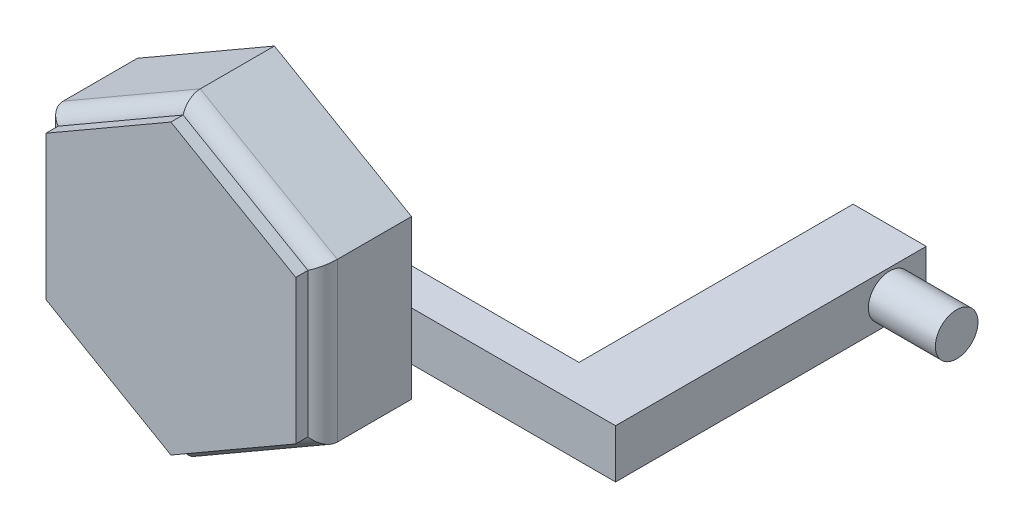
ISO-10303-21;
HEADER;
FILE_DESCRIPTION(('STEP AP214'),'2;1');
FILE_NAME('part.step','',(''),(''),'','','');
FILE_SCHEMA(('AUTOMOTIVE_DESIGN { 1 0 10303 214 1 1 1 1 }'));
ENDSEC;
DATA;
#1=APPLICATION_CONTEXT('core data for automotive mechanical design processes');
#2=APPLICATION_PROTOCOL_DEFINITION('international standard','automotive_design',2000,#1);
#3=PRODUCT_CONTEXT('',#1,'mechanical');
#4=PRODUCT('Part','Part','',(#3));
#5=PRODUCT_RELATED_PRODUCT_CATEGORY('part','',(#4));
#6=PRODUCT_DEFINITION_FORMATION('','',#4);
#7=PRODUCT_DEFINITION_CONTEXT('part definition',#1,'design');
#8=PRODUCT_DEFINITION('design','',#6,#7);
#9=PRODUCT_DEFINITION_SHAPE('','',#8);
#10=(LENGTH_UNIT() NAMED_UNIT(*) SI_UNIT(.MILLI.,.METRE.));
#11=(NAMED_UNIT(*) PLANE_ANGLE_UNIT() SI_UNIT($,.RADIAN.));
#12=(NAMED_UNIT(*) SI_UNIT($,.STERADIAN.) SOLID_ANGLE_UNIT());
#13=UNCERTAINTY_MEASURE_WITH_UNIT(LENGTH_MEASURE(1.E-05),#10,'distance_accuracy_value','');
#14=(GEOMETRIC_REPRESENTATION_CONTEXT(3) GLOBAL_UNCERTAINTY_ASSIGNED_CONTEXT((#13)) GLOBAL_UNIT_ASSIGNED_CONTEXT((#10,
#11,#12)) REPRESENTATION_CONTEXT('',''));
#15=CARTESIAN_POINT('',(0.,0.,0.));
#16=DIRECTION('',(0.,0.,1.));
#17=DIRECTION('',(1.,0.,0.));
#18=AXIS2_PLACEMENT_3D('',#15,#16,#17);
#19=CARTESIAN_POINT('',(0.,0.,-6.));
#20=DIRECTION('',(0.,0.,1.));
#21=DIRECTION('',(1.,0.,0.));
#22=AXIS2_PLACEMENT_3D('',#19,#20,#21);
#23=PLANE('',#22);
#24=DIRECTION('',(-1.,0.,0.));
#25=VECTOR('',#24,1.);
#26=CARTESIAN_POINT('',(0.,-8.,-6.));
#27=LINE('',#26,#25);
#28=CARTESIAN_POINT('',(44.,-8.00000000000001,-6.));
#29=VERTEX_POINT('',#28);
#30=CARTESIAN_POINT('',(4.,-8.,-6.));
#31=VERTEX_POINT('',#30);
#32=EDGE_CURVE('E205',#29,#31,#27,.T.);
#33=ORIENTED_EDGE('',*,*,#32,.T.);
#34=DIRECTION('',(0.,1.,0.));
#35=VECTOR('',#34,1.);
#36=CARTESIAN_POINT('',(4.,0.,-6.));
#37=LINE('',#36,#35);
#38=CARTESIAN_POINT('',(4.,0.,-6.));
#39=VERTEX_POINT('',#38);
#40=EDGE_CURVE('E334',#31,#39,#37,.T.);
#41=ORIENTED_EDGE('',*,*,#40,.T.);
#42=DIRECTION('',(1.,0.,0.));
#43=VECTOR('',#42,1.);
#44=CARTESIAN_POINT('',(0.,0.,-6.));
#45=LINE('',#44,#43);
#46=CARTESIAN_POINT('',(44.,0.,-6.));
#47=VERTEX_POINT('',#46);
#48=EDGE_CURVE('E203',#39,#47,#45,.T.);
#49=ORIENTED_EDGE('',*,*,#48,.T.);
#50=DIRECTION('',(0.,1.,0.));
#51=VECTOR('',#50,1.);
#52=CARTESIAN_POINT('',(44.,0.,-6.));
#53=LINE('',#52,#51);
#54=EDGE_CURVE('E191',#29,#47,#53,.T.);
#55=ORIENTED_EDGE('',*,*,#54,.F.);
#56=EDGE_LOOP('',(#33,#41,#49,#55));
#57=FACE_BOUND('',#56,.T.);
#58=ADVANCED_FACE('F36',(#57),#23,.F.);
#59=CARTESIAN_POINT('',(0.,0.,0.));
#60=DIRECTION('',(0.,0.,1.));
#61=DIRECTION('',(1.,0.,0.));
#62=AXIS2_PLACEMENT_3D('',#59,#60,#61);
#63=PLANE('',#62);
#64=DIRECTION('',(-1.,0.,0.));
#65=VECTOR('',#64,1.);
#66=CARTESIAN_POINT('',(0.,-8.,0.));
#67=LINE('',#66,#65);
#68=CARTESIAN_POINT('',(22.5,-8.,0.));
#69=VERTEX_POINT('',#68);
#70=CARTESIAN_POINT('',(0.,-8.,0.));
#71=VERTEX_POINT('',#70);
#72=EDGE_CURVE('E217',#69,#71,#67,.T.);
#73=ORIENTED_EDGE('',*,*,#72,.F.);
#74=DIRECTION('',(0.,1.,0.));
#75=VECTOR('',#74,1.);
#76=CARTESIAN_POINT('',(22.5,-12.9903810567666,0.));
#77=LINE('',#76,#75);
#78=CARTESIAN_POINT('',(22.5,-12.9903810567666,0.));
#79=VERTEX_POINT('',#78);
#80=EDGE_CURVE('E287',#79,#69,#77,.T.);
#81=ORIENTED_EDGE('',*,*,#80,.F.);
#82=DIRECTION('',(0.866025403784438,0.5,0.));
#83=VECTOR('',#82,1.);
#84=CARTESIAN_POINT('',(0.,-25.9807621135332,0.));
#85=LINE('',#84,#83);
#86=CARTESIAN_POINT('',(0.,-25.9807621135332,0.));
#87=VERTEX_POINT('',#86);
#88=EDGE_CURVE('E283',#87,#79,#85,.T.);
#89=ORIENTED_EDGE('',*,*,#88,.F.);
#90=DIRECTION('',(0.866025403784439,-0.5,0.));
#91=VECTOR('',#90,1.);
#92=CARTESIAN_POINT('',(-22.5,-12.9903810567666,0.));
#93=LINE('',#92,#91);
#94=CARTESIAN_POINT('',(-22.5,-12.9903810567666,0.));
#95=VERTEX_POINT('',#94);
#96=EDGE_CURVE('E280',#95,#87,#93,.T.);
#97=ORIENTED_EDGE('',*,*,#96,.F.);
#98=DIRECTION('',(0.,-1.,0.));
#99=VECTOR('',#98,1.);
#100=CARTESIAN_POINT('',(-22.5,12.9903810567666,0.));
#101=LINE('',#100,#99);
#102=CARTESIAN_POINT('',(-22.5,12.9903810567666,0.));
#103=VERTEX_POINT('',#102);
#104=EDGE_CURVE('E277',#103,#95,#101,.T.);
#105=ORIENTED_EDGE('',*,*,#104,.F.);
#106=DIRECTION('',(-0.866025403784438,-0.5,0.));
#107=VECTOR('',#106,1.);
#108=CARTESIAN_POINT('',(0.,25.9807621135332,0.));
#109=LINE('',#108,#107);
#110=CARTESIAN_POINT('',(0.,25.9807621135332,0.));
#111=VERTEX_POINT('',#110);
#112=EDGE_CURVE('E274',#111,#103,#109,.T.);
#113=ORIENTED_EDGE('',*,*,#112,.F.);
#114=DIRECTION('',(-0.866025403784439,0.5,0.));
#115=VECTOR('',#114,1.);
#116=CARTESIAN_POINT('',(22.5,12.9903810567666,0.));
#117=LINE('',#116,#115);
#118=CARTESIAN_POINT('',(22.5,12.9903810567666,0.));
#119=VERTEX_POINT('',#118);
#120=EDGE_CURVE('E271',#119,#111,#117,.T.);
#121=ORIENTED_EDGE('',*,*,#120,.F.);
#122=CARTESIAN_POINT('',(22.5,0.,0.));
#123=VERTEX_POINT('',#122);
#124=EDGE_CURVE('E286',#123,#119,#77,.T.);
#125=ORIENTED_EDGE('',*,*,#124,.F.);
#126=DIRECTION('',(1.,0.,0.));
#127=VECTOR('',#126,1.);
#128=CARTESIAN_POINT('',(0.,0.,0.));
#129=LINE('',#128,#127);
#130=CARTESIAN_POINT('',(0.,0.,0.));
#131=VERTEX_POINT('',#130);
#132=EDGE_CURVE('E210',#131,#123,#129,.T.);
#133=ORIENTED_EDGE('',*,*,#132,.F.);
#134=DIRECTION('',(0.,1.,0.));
#135=VECTOR('',#134,1.);
#136=CARTESIAN_POINT('',(0.,0.,0.));
#137=LINE('',#136,#135);
#138=EDGE_CURVE('E194',#71,#131,#137,.T.);
#139=ORIENTED_EDGE('',*,*,#138,.F.);
#140=EDGE_LOOP('',(#73,#81,#89,#97,#105,#113,#121,#125,#133,#139));
#141=FACE_BOUND('',#140,.T.);
#142=ADVANCED_FACE('F349',(#141),#63,.F.);
#143=CARTESIAN_POINT('',(22.5,12.9903810567666,15.));
#144=DIRECTION('',(-0.5,-0.866025403784439,0.));
#145=DIRECTION('',(0.866025403784439,-0.5,0.));
#146=AXIS2_PLACEMENT_3D('',#143,#144,#145);
#147=PLANE('',#146);
#148=DIRECTION('',(0.,0.,-1.));
#149=VECTOR('',#148,1.);
#150=CARTESIAN_POINT('',(0.,25.9807621135332,15.));
#151=LINE('',#150,#149);
#152=CARTESIAN_POINT('',(0.,25.9807621135332,12.1715728752538));
#153=VERTEX_POINT('',#152);
#154=EDGE_CURVE('E302',#153,#111,#151,.T.);
#155=ORIENTED_EDGE('',*,*,#154,.F.);
#156=DIRECTION('',(0.866025403784439,-0.5,0.));
#157=VECTOR('',#156,1.);
#158=CARTESIAN_POINT('',(22.5,12.9903810567666,12.1715728752538));
#159=LINE('',#158,#157);
#160=CARTESIAN_POINT('',(22.5,12.9903810567666,12.1715728752538));
#161=VERTEX_POINT('',#160);
#162=EDGE_CURVE('E315',#153,#161,#159,.T.);
#163=ORIENTED_EDGE('',*,*,#162,.T.);
#164=DIRECTION('',(0.,0.,-1.));
#165=VECTOR('',#164,1.);
#166=CARTESIAN_POINT('',(22.5,12.9903810567666,15.));
#167=LINE('',#166,#165);
#168=EDGE_CURVE('E290',#161,#119,#167,.T.);
#169=ORIENTED_EDGE('',*,*,#168,.T.);
#170=ORIENTED_EDGE('',*,*,#120,.T.);
#171=EDGE_LOOP('',(#155,#163,#169,#170));
#172=FACE_BOUND('',#171,.T.);
#173=ADVANCED_FACE('F389',(#172),#147,.F.);
#174=CARTESIAN_POINT('',(0.,25.9807621135332,15.));
#175=DIRECTION('',(0.5,-0.866025403784438,0.));
#176=DIRECTION('',(0.866025403784438,0.5,0.));
#177=AXIS2_PLACEMENT_3D('',#174,#175,#176);
#178=PLANE('',#177);
#179=DIRECTION('',(0.,0.,-1.));
#180=VECTOR('',#179,1.);
#181=CARTESIAN_POINT('',(-22.5,12.9903810567666,15.));
#182=LINE('',#181,#180);
#183=CARTESIAN_POINT('',(-22.5,12.9903810567666,12.1715728752538));
#184=VERTEX_POINT('',#183);
#185=EDGE_CURVE('E300',#184,#103,#182,.T.);
#186=ORIENTED_EDGE('',*,*,#185,.F.);
#187=DIRECTION('',(0.866025403784438,0.5,0.));
#188=VECTOR('',#187,1.);
#189=CARTESIAN_POINT('',(0.,25.9807621135332,12.1715728752538));
#190=LINE('',#189,#188);
#191=EDGE_CURVE('E304',#184,#153,#190,.T.);
#192=ORIENTED_EDGE('',*,*,#191,.T.);
#193=ORIENTED_EDGE('',*,*,#154,.T.);
#194=ORIENTED_EDGE('',*,*,#112,.T.);
#195=EDGE_LOOP('',(#186,#192,#193,#194));
#196=FACE_BOUND('',#195,.T.);
#197=ADVANCED_FACE('F490',(#196),#178,.F.);
#198=CARTESIAN_POINT('',(-22.5,12.9903810567666,15.));
#199=DIRECTION('',(1.,0.,0.));
#200=DIRECTION('',(0.,1.,0.));
#201=AXIS2_PLACEMENT_3D('',#198,#199,#200);
#202=PLANE('',#201);
#203=DIRECTION('',(0.,0.,-1.));
#204=VECTOR('',#203,1.);
#205=CARTESIAN_POINT('',(-22.5,-12.9903810567666,15.));
#206=LINE('',#205,#204);
#207=CARTESIAN_POINT('',(-22.5,-12.9903810567666,12.1715728752538));
#208=VERTEX_POINT('',#207);
#209=EDGE_CURVE('E298',#208,#95,#206,.T.);
#210=ORIENTED_EDGE('',*,*,#209,.F.);
#211=DIRECTION('',(0.,1.,0.));
#212=VECTOR('',#211,1.);
#213=CARTESIAN_POINT('',(-22.5,12.9903810567666,12.1715728752538));
#214=LINE('',#213,#212);
#215=EDGE_CURVE('E307',#208,#184,#214,.T.);
#216=ORIENTED_EDGE('',*,*,#215,.T.);
#217=ORIENTED_EDGE('',*,*,#185,.T.);
#218=ORIENTED_EDGE('',*,*,#104,.T.);
#219=EDGE_LOOP('',(#210,#216,#217,#218));
#220=FACE_BOUND('',#219,.T.);
#221=ADVANCED_FACE('F446',(#220),#202,.F.);
#222=CARTESIAN_POINT('',(-22.5,-12.9903810567666,15.));
#223=DIRECTION('',(0.5,0.866025403784439,0.));
#224=DIRECTION('',(-0.866025403784439,0.5,0.));
#225=AXIS2_PLACEMENT_3D('',#222,#223,#224);
#226=PLANE('',#225);
#227=DIRECTION('',(0.,0.,-1.));
#228=VECTOR('',#227,1.);
#229=CARTESIAN_POINT('',(0.,-25.9807621135332,15.));
#230=LINE('',#229,#228);
#231=CARTESIAN_POINT('',(0.,-25.9807621135332,12.1715728752538));
#232=VERTEX_POINT('',#231);
#233=EDGE_CURVE('E296',#232,#87,#230,.T.);
#234=ORIENTED_EDGE('',*,*,#233,.F.);
#235=DIRECTION('',(-0.866025403784439,0.5,0.));
#236=VECTOR('',#235,1.);
#237=CARTESIAN_POINT('',(-22.5,-12.9903810567666,12.1715728752538));
#238=LINE('',#237,#236);
#239=EDGE_CURVE('E309',#232,#208,#238,.T.);
#240=ORIENTED_EDGE('',*,*,#239,.T.);
#241=ORIENTED_EDGE('',*,*,#209,.T.);
#242=ORIENTED_EDGE('',*,*,#96,.T.);
#243=EDGE_LOOP('',(#234,#240,#241,#242));
#244=FACE_BOUND('',#243,.T.);
#245=ADVANCED_FACE('F444',(#244),#226,.F.);
#246=CARTESIAN_POINT('',(0.,-25.9807621135332,15.));
#247=DIRECTION('',(-0.5,0.866025403784438,0.));
#248=DIRECTION('',(-0.866025403784439,-0.5,0.));
#249=AXIS2_PLACEMENT_3D('',#246,#247,#248);
#250=PLANE('',#249);
#251=DIRECTION('',(0.,0.,-1.));
#252=VECTOR('',#251,1.);
#253=CARTESIAN_POINT('',(22.5,-12.9903810567666,15.));
#254=LINE('',#253,#252);
#255=CARTESIAN_POINT('',(22.5,-12.9903810567666,12.1715728752538));
#256=VERTEX_POINT('',#255);
#257=EDGE_CURVE('E294',#256,#79,#254,.T.);
#258=ORIENTED_EDGE('',*,*,#257,.F.);
#259=DIRECTION('',(-0.866025403784439,-0.5,0.));
#260=VECTOR('',#259,1.);
#261=CARTESIAN_POINT('',(0.,-25.9807621135332,12.1715728752538));
#262=LINE('',#261,#260);
#263=EDGE_CURVE('E311',#256,#232,#262,.T.);
#264=ORIENTED_EDGE('',*,*,#263,.T.);
#265=ORIENTED_EDGE('',*,*,#233,.T.);
#266=ORIENTED_EDGE('',*,*,#88,.T.);
#267=EDGE_LOOP('',(#258,#264,#265,#266));
#268=FACE_BOUND('',#267,.T.);
#269=ADVANCED_FACE('F454',(#268),#250,.F.);
#270=CARTESIAN_POINT('',(22.5,-12.9903810567666,15.));
#271=DIRECTION('',(-1.,0.,0.));
#272=DIRECTION('',(0.,-1.,0.));
#273=AXIS2_PLACEMENT_3D('',#270,#271,#272);
#274=PLANE('',#273);
#275=ORIENTED_EDGE('',*,*,#168,.F.);
#276=DIRECTION('',(0.,-1.,0.));
#277=VECTOR('',#276,1.);
#278=CARTESIAN_POINT('',(22.5,-12.9903810567666,12.1715728752538));
#279=LINE('',#278,#277);
#280=EDGE_CURVE('E313',#161,#256,#279,.T.);
#281=ORIENTED_EDGE('',*,*,#280,.T.);
#282=ORIENTED_EDGE('',*,*,#257,.T.);
#283=ORIENTED_EDGE('',*,*,#80,.T.);
#284=EDGE_CURVE('E291',#69,#123,#77,.T.);
#285=ORIENTED_EDGE('',*,*,#284,.T.);
#286=ORIENTED_EDGE('',*,*,#124,.T.);
#287=EDGE_LOOP('',(#275,#281,#282,#283,#285,#286));
#288=FACE_BOUND('',#287,.T.);
#289=ADVANCED_FACE('F457',(#288),#274,.F.);
#290=CARTESIAN_POINT('',(20.5,-11.8356805183873,17.));
#291=DIRECTION('',(-1.,0.,0.));
#292=DIRECTION('',(0.,-1.,0.));
#293=AXIS2_PLACEMENT_3D('',#290,#291,#292);
#294=PLANE('',#293);
#295=DIRECTION('',(0.,1.,0.));
#296=VECTOR('',#295,1.);
#297=CARTESIAN_POINT('',(20.5,-11.8356805183873,15.));
#298=LINE('',#297,#296);
#299=CARTESIAN_POINT('',(20.5,-11.8356805183873,15.));
#300=VERTEX_POINT('',#299);
#301=CARTESIAN_POINT('',(20.5,11.8356805183873,15.));
#302=VERTEX_POINT('',#301);
#303=EDGE_CURVE('E241',#300,#302,#298,.T.);
#304=ORIENTED_EDGE('',*,*,#303,.T.);
#305=DIRECTION('',(0.,0.,-1.));
#306=VECTOR('',#305,1.);
#307=CARTESIAN_POINT('',(20.5,11.8356805183873,17.));
#308=LINE('',#307,#306);
#309=CARTESIAN_POINT('',(20.5,11.8356805183873,17.));
#310=VERTEX_POINT('',#309);
#311=EDGE_CURVE('E269',#310,#302,#308,.T.);
#312=ORIENTED_EDGE('',*,*,#311,.F.);
#313=DIRECTION('',(0.,1.,0.));
#314=VECTOR('',#313,1.);
#315=CARTESIAN_POINT('',(20.5,-11.8356805183873,17.));
#316=LINE('',#315,#314);
#317=CARTESIAN_POINT('',(20.5,-11.8356805183873,17.));
#318=VERTEX_POINT('',#317);
#319=EDGE_CURVE('E226',#318,#310,#316,.T.);
#320=ORIENTED_EDGE('',*,*,#319,.F.);
#321=DIRECTION('',(0.,0.,-1.));
#322=VECTOR('',#321,1.);
#323=CARTESIAN_POINT('',(20.5,-11.8356805183873,17.));
#324=LINE('',#323,#322);
#325=EDGE_CURVE('E240',#318,#300,#324,.T.);
#326=ORIENTED_EDGE('',*,*,#325,.T.);
#327=EDGE_LOOP('',(#304,#312,#320,#326));
#328=FACE_BOUND('',#327,.T.);
#329=ADVANCED_FACE('F479',(#328),#294,.F.);
#330=CARTESIAN_POINT('',(20.5,11.8356805183873,17.));
#331=DIRECTION('',(-0.5,-0.866025403784439,0.));
#332=DIRECTION('',(0.866025403784439,-0.5,0.));
#333=AXIS2_PLACEMENT_3D('',#330,#331,#332);
#334=PLANE('',#333);
#335=DIRECTION('',(-0.866025403784439,0.5,0.));
#336=VECTOR('',#335,1.);
#337=CARTESIAN_POINT('',(20.5,11.8356805183873,15.));
#338=LINE('',#337,#336);
#339=CARTESIAN_POINT('',(0.,23.6713610367747,15.));
#340=VERTEX_POINT('',#339);
#341=EDGE_CURVE('E244',#302,#340,#338,.T.);
#342=ORIENTED_EDGE('',*,*,#341,.T.);
#343=DIRECTION('',(0.,0.,-1.));
#344=VECTOR('',#343,1.);
#345=CARTESIAN_POINT('',(0.,23.6713610367747,17.));
#346=LINE('',#345,#344);
#347=CARTESIAN_POINT('',(0.,23.6713610367747,17.));
#348=VERTEX_POINT('',#347);
#349=EDGE_CURVE('E266',#348,#340,#346,.T.);
#350=ORIENTED_EDGE('',*,*,#349,.F.);
#351=DIRECTION('',(-0.866025403784439,0.5,0.));
#352=VECTOR('',#351,1.);
#353=CARTESIAN_POINT('',(20.5,11.8356805183873,17.));
#354=LINE('',#353,#352);
#355=EDGE_CURVE('E229',#310,#348,#354,.T.);
#356=ORIENTED_EDGE('',*,*,#355,.F.);
#357=ORIENTED_EDGE('',*,*,#311,.T.);
#358=EDGE_LOOP('',(#342,#350,#356,#357));
#359=FACE_BOUND('',#358,.T.);
#360=ADVANCED_FACE('F467',(#359),#334,.F.);
#361=CARTESIAN_POINT('',(0.,23.6713610367747,17.));
#362=DIRECTION('',(0.5,-0.866025403784438,0.));
#363=DIRECTION('',(0.866025403784438,0.5,0.));
#364=AXIS2_PLACEMENT_3D('',#361,#362,#363);
#365=PLANE('',#364);
#366=DIRECTION('',(-0.866025403784438,-0.5,0.));
#367=VECTOR('',#366,1.);
#368=CARTESIAN_POINT('',(0.,23.6713610367747,15.));
#369=LINE('',#368,#367);
#370=CARTESIAN_POINT('',(-20.5,11.8356805183873,15.));
#371=VERTEX_POINT('',#370);
#372=EDGE_CURVE('E247',#340,#371,#369,.T.);
#373=ORIENTED_EDGE('',*,*,#372,.T.);
#374=DIRECTION('',(0.,0.,-1.));
#375=VECTOR('',#374,1.);
#376=CARTESIAN_POINT('',(-20.5,11.8356805183873,17.));
#377=LINE('',#376,#375);
#378=CARTESIAN_POINT('',(-20.5,11.8356805183873,17.));
#379=VERTEX_POINT('',#378);
#380=EDGE_CURVE('E263',#379,#371,#377,.T.);
#381=ORIENTED_EDGE('',*,*,#380,.F.);
#382=DIRECTION('',(-0.866025403784438,-0.5,0.));
#383=VECTOR('',#382,1.);
#384=CARTESIAN_POINT('',(0.,23.6713610367747,17.));
#385=LINE('',#384,#383);
#386=EDGE_CURVE('E232',#348,#379,#385,.T.);
#387=ORIENTED_EDGE('',*,*,#386,.F.);
#388=ORIENTED_EDGE('',*,*,#349,.T.);
#389=EDGE_LOOP('',(#373,#381,#387,#388));
#390=FACE_BOUND('',#389,.T.);
#391=ADVANCED_FACE('F471',(#390),#365,.F.);
#392=CARTESIAN_POINT('',(-20.5,11.8356805183873,17.));
#393=DIRECTION('',(1.,0.,0.));
#394=DIRECTION('',(0.,1.,0.));
#395=AXIS2_PLACEMENT_3D('',#392,#393,#394);
#396=PLANE('',#395);
#397=DIRECTION('',(0.,-1.,0.));
#398=VECTOR('',#397,1.);
#399=CARTESIAN_POINT('',(-20.5,11.8356805183873,15.));
#400=LINE('',#399,#398);
#401=CARTESIAN_POINT('',(-20.5,-11.8356805183873,15.));
#402=VERTEX_POINT('',#401);
#403=EDGE_CURVE('E250',#371,#402,#400,.T.);
#404=ORIENTED_EDGE('',*,*,#403,.T.);
#405=DIRECTION('',(0.,0.,-1.));
#406=VECTOR('',#405,1.);
#407=CARTESIAN_POINT('',(-20.5,-11.8356805183873,17.));
#408=LINE('',#407,#406);
#409=CARTESIAN_POINT('',(-20.5,-11.8356805183873,17.));
#410=VERTEX_POINT('',#409);
#411=EDGE_CURVE('E260',#410,#402,#408,.T.);
#412=ORIENTED_EDGE('',*,*,#411,.F.);
#413=DIRECTION('',(0.,-1.,0.));
#414=VECTOR('',#413,1.);
#415=CARTESIAN_POINT('',(-20.5,11.8356805183873,17.));
#416=LINE('',#415,#414);
#417=EDGE_CURVE('E234',#379,#410,#416,.T.);
#418=ORIENTED_EDGE('',*,*,#417,.F.);
#419=ORIENTED_EDGE('',*,*,#380,.T.);
#420=EDGE_LOOP('',(#404,#412,#418,#419));
#421=FACE_BOUND('',#420,.T.);
#422=ADVANCED_FACE('F513',(#421),#396,.F.);
#423=CARTESIAN_POINT('',(-20.5,-11.8356805183873,17.));
#424=DIRECTION('',(0.5,0.866025403784438,0.));
#425=DIRECTION('',(-0.866025403784439,0.5,0.));
#426=AXIS2_PLACEMENT_3D('',#423,#424,#425);
#427=PLANE('',#426);
#428=DIRECTION('',(0.866025403784438,-0.5,0.));
#429=VECTOR('',#428,1.);
#430=CARTESIAN_POINT('',(-20.5,-11.8356805183873,15.));
#431=LINE('',#430,#429);
#432=CARTESIAN_POINT('',(0.,-23.6713610367747,15.));
#433=VERTEX_POINT('',#432);
#434=EDGE_CURVE('E252',#402,#433,#431,.T.);
#435=ORIENTED_EDGE('',*,*,#434,.T.);
#436=DIRECTION('',(0.,0.,-1.));
#437=VECTOR('',#436,1.);
#438=CARTESIAN_POINT('',(0.,-23.6713610367747,17.));
#439=LINE('',#438,#437);
#440=CARTESIAN_POINT('',(0.,-23.6713610367747,17.));
#441=VERTEX_POINT('',#440);
#442=EDGE_CURVE('E257',#441,#433,#439,.T.);
#443=ORIENTED_EDGE('',*,*,#442,.F.);
#444=DIRECTION('',(0.866025403784438,-0.5,0.));
#445=VECTOR('',#444,1.);
#446=CARTESIAN_POINT('',(-20.5,-11.8356805183873,17.));
#447=LINE('',#446,#445);
#448=EDGE_CURVE('E236',#410,#441,#447,.T.);
#449=ORIENTED_EDGE('',*,*,#448,.F.);
#450=ORIENTED_EDGE('',*,*,#411,.T.);
#451=EDGE_LOOP('',(#435,#443,#449,#450));
#452=FACE_BOUND('',#451,.T.);
#453=ADVANCED_FACE('F484',(#452),#427,.F.);
#454=CARTESIAN_POINT('',(0.,-23.6713610367747,17.));
#455=DIRECTION('',(-0.5,0.866025403784438,0.));
#456=DIRECTION('',(-0.866025403784438,-0.5,0.));
#457=AXIS2_PLACEMENT_3D('',#454,#455,#456);
#458=PLANE('',#457);
#459=DIRECTION('',(0.866025403784438,0.5,0.));
#460=VECTOR('',#459,1.);
#461=CARTESIAN_POINT('',(0.,-23.6713610367747,15.));
#462=LINE('',#461,#460);
#463=EDGE_CURVE('E230',#433,#300,#462,.T.);
#464=ORIENTED_EDGE('',*,*,#463,.T.);
#465=ORIENTED_EDGE('',*,*,#325,.F.);
#466=DIRECTION('',(0.866025403784438,0.5,0.));
#467=VECTOR('',#466,1.);
#468=CARTESIAN_POINT('',(0.,-23.6713610367747,17.));
#469=LINE('',#468,#467);
#470=EDGE_CURVE('E238',#441,#318,#469,.T.);
#471=ORIENTED_EDGE('',*,*,#470,.F.);
#472=ORIENTED_EDGE('',*,*,#442,.T.);
#473=EDGE_LOOP('',(#464,#465,#471,#472));
#474=FACE_BOUND('',#473,.T.);
#475=ADVANCED_FACE('F430',(#474),#458,.F.);
#476=CARTESIAN_POINT('',(0.,0.,17.));
#477=DIRECTION('',(0.,0.,1.));
#478=DIRECTION('',(1.,0.,0.));
#479=AXIS2_PLACEMENT_3D('',#476,#477,#478);
#480=PLANE('',#479);
#481=ORIENTED_EDGE('',*,*,#319,.T.);
#482=ORIENTED_EDGE('',*,*,#355,.T.);
#483=ORIENTED_EDGE('',*,*,#386,.T.);
#484=ORIENTED_EDGE('',*,*,#417,.T.);
#485=ORIENTED_EDGE('',*,*,#448,.T.);
#486=ORIENTED_EDGE('',*,*,#470,.T.);
#487=EDGE_LOOP('',(#481,#482,#483,#484,#485,#486));
#488=FACE_BOUND('',#487,.T.);
#489=ADVANCED_FACE('F425',(#488),#480,.T.);
#490=CARTESIAN_POINT('',(9.75,-16.8874953737965,12.1715728752538));
#491=DIRECTION('',(-0.866025403784438,-0.5,0.));
#492=DIRECTION('',(0.5,-0.866025403784438,0.));
#493=AXIS2_PLACEMENT_3D('',#490,#491,#492);
#494=CYLINDRICAL_SURFACE('',#493,3.);
#495=CARTESIAN_POINT('',(0.,-22.5166604983954,12.1715728752538));
#496=DIRECTION('',(-1.,0.,0.));
#497=DIRECTION('',(0.,-1.,0.));
#498=AXIS2_PLACEMENT_3D('',#495,#496,#497);
#499=ELLIPSE('',#498,3.46410161513776,3.);
#500=EDGE_CURVE('E326',#232,#433,#499,.T.);
#501=ORIENTED_EDGE('',*,*,#500,.F.);
#502=ORIENTED_EDGE('',*,*,#263,.F.);
#503=CARTESIAN_POINT('',(19.5,-11.2583302491977,12.1715728752538));
#504=DIRECTION('',(-0.5,-0.866025403784439,0.));
#505=DIRECTION('',(0.866025403784439,-0.5,0.));
#506=AXIS2_PLACEMENT_3D('',#503,#504,#505);
#507=ELLIPSE('',#506,3.46410161513775,3.);
#508=EDGE_CURVE('E245',#300,#256,#507,.F.);
#509=ORIENTED_EDGE('',*,*,#508,.F.);
#510=ORIENTED_EDGE('',*,*,#463,.F.);
#511=EDGE_LOOP('',(#501,#502,#509,#510));
#512=FACE_BOUND('',#511,.T.);
#513=ADVANCED_FACE('F422',(#512),#494,.T.);
#514=CARTESIAN_POINT('',(19.5,0.,12.1715728752538));
#515=DIRECTION('',(0.,-1.,0.));
#516=DIRECTION('',(1.,0.,0.));
#517=AXIS2_PLACEMENT_3D('',#514,#515,#516);
#518=CYLINDRICAL_SURFACE('',#517,3.);
#519=ORIENTED_EDGE('',*,*,#508,.T.);
#520=ORIENTED_EDGE('',*,*,#280,.F.);
#521=CARTESIAN_POINT('',(19.5,11.2583302491977,12.1715728752538));
#522=DIRECTION('',(0.5,-0.866025403784438,0.));
#523=DIRECTION('',(0.866025403784438,0.5,0.));
#524=AXIS2_PLACEMENT_3D('',#521,#522,#523);
#525=ELLIPSE('',#524,3.46410161513775,3.);
#526=EDGE_CURVE('E323',#302,#161,#525,.F.);
#527=ORIENTED_EDGE('',*,*,#526,.F.);
#528=ORIENTED_EDGE('',*,*,#303,.F.);
#529=EDGE_LOOP('',(#519,#520,#527,#528));
#530=FACE_BOUND('',#529,.T.);
#531=ADVANCED_FACE('F419',(#530),#518,.T.);
#532=CARTESIAN_POINT('',(-9.75,-16.8874953737965,12.1715728752538));
#533=DIRECTION('',(-0.866025403784439,0.5,0.));
#534=DIRECTION('',(-0.5,-0.866025403784438,0.));
#535=AXIS2_PLACEMENT_3D('',#532,#533,#534);
#536=CYLINDRICAL_SURFACE('',#535,3.);
#537=ORIENTED_EDGE('',*,*,#500,.T.);
#538=ORIENTED_EDGE('',*,*,#434,.F.);
#539=CARTESIAN_POINT('',(-19.5,-11.2583302491977,12.1715728752538));
#540=DIRECTION('',(-0.5,0.866025403784439,0.));
#541=DIRECTION('',(-0.866025403784439,-0.5,0.));
#542=AXIS2_PLACEMENT_3D('',#539,#540,#541);
#543=ELLIPSE('',#542,3.46410161513775,3.);
#544=EDGE_CURVE('E320',#208,#402,#543,.T.);
#545=ORIENTED_EDGE('',*,*,#544,.F.);
#546=ORIENTED_EDGE('',*,*,#239,.F.);
#547=EDGE_LOOP('',(#537,#538,#545,#546));
#548=FACE_BOUND('',#547,.T.);
#549=ADVANCED_FACE('F415',(#548),#536,.T.);
#550=CARTESIAN_POINT('',(9.75,16.8874953737966,12.1715728752538));
#551=DIRECTION('',(0.866025403784439,-0.5,0.));
#552=DIRECTION('',(0.5,0.866025403784439,0.));
#553=AXIS2_PLACEMENT_3D('',#550,#551,#552);
#554=CYLINDRICAL_SURFACE('',#553,3.);
#555=ORIENTED_EDGE('',*,*,#526,.T.);
#556=ORIENTED_EDGE('',*,*,#162,.F.);
#557=CARTESIAN_POINT('',(0.,22.5166604983954,12.1715728752538));
#558=DIRECTION('',(1.,0.,0.));
#559=DIRECTION('',(0.,-1.,0.));
#560=AXIS2_PLACEMENT_3D('',#557,#558,#559);
#561=ELLIPSE('',#560,3.46410161513775,3.);
#562=EDGE_CURVE('E318',#340,#153,#561,.F.);
#563=ORIENTED_EDGE('',*,*,#562,.F.);
#564=ORIENTED_EDGE('',*,*,#341,.F.);
#565=EDGE_LOOP('',(#555,#556,#563,#564));
#566=FACE_BOUND('',#565,.T.);
#567=ADVANCED_FACE('F407',(#566),#554,.T.);
#568=CARTESIAN_POINT('',(-19.5,0.,12.1715728752538));
#569=DIRECTION('',(0.,1.,0.));
#570=DIRECTION('',(-1.,0.,0.));
#571=AXIS2_PLACEMENT_3D('',#568,#569,#570);
#572=CYLINDRICAL_SURFACE('',#571,3.);
#573=ORIENTED_EDGE('',*,*,#544,.T.);
#574=ORIENTED_EDGE('',*,*,#403,.F.);
#575=CARTESIAN_POINT('',(-19.5,11.2583302491977,12.1715728752538));
#576=DIRECTION('',(0.5,0.866025403784439,0.));
#577=DIRECTION('',(-0.866025403784439,0.5,0.));
#578=AXIS2_PLACEMENT_3D('',#575,#576,#577);
#579=ELLIPSE('',#578,3.46410161513775,3.);
#580=EDGE_CURVE('E225',#184,#371,#579,.T.);
#581=ORIENTED_EDGE('',*,*,#580,.F.);
#582=ORIENTED_EDGE('',*,*,#215,.F.);
#583=EDGE_LOOP('',(#573,#574,#581,#582));
#584=FACE_BOUND('',#583,.T.);
#585=ADVANCED_FACE('F401',(#584),#572,.T.);
#586=CARTESIAN_POINT('',(-9.75,16.8874953737965,12.1715728752538));
#587=DIRECTION('',(0.866025403784438,0.5,0.));
#588=DIRECTION('',(-0.5,0.866025403784438,0.));
#589=AXIS2_PLACEMENT_3D('',#586,#587,#588);
#590=CYLINDRICAL_SURFACE('',#589,3.);
#591=ORIENTED_EDGE('',*,*,#562,.T.);
#592=ORIENTED_EDGE('',*,*,#191,.F.);
#593=ORIENTED_EDGE('',*,*,#580,.T.);
#594=ORIENTED_EDGE('',*,*,#372,.F.);
#595=EDGE_LOOP('',(#591,#592,#593,#594));
#596=FACE_BOUND('',#595,.T.);
#597=ADVANCED_FACE('F395',(#596),#590,.T.);
#598=CARTESIAN_POINT('',(0.,0.,0.));
#599=DIRECTION('',(0.,0.,1.));
#600=DIRECTION('',(1.,0.,0.));
#601=AXIS2_PLACEMENT_3D('',#598,#599,#600);
#602=PLANE('',#601);
#603=ORIENTED_EDGE('',*,*,#284,.F.);
#604=CARTESIAN_POINT('',(56.,-8.00000000000001,0.));
#605=VERTEX_POINT('',#604);
#606=EDGE_CURVE('E206',#605,#69,#67,.T.);
#607=ORIENTED_EDGE('',*,*,#606,.F.);
#608=DIRECTION('',(0.,-1.,0.));
#609=VECTOR('',#608,1.);
#610=CARTESIAN_POINT('',(56.,0.,0.));
#611=LINE('',#610,#609);
#612=CARTESIAN_POINT('',(56.,0.,0.));
#613=VERTEX_POINT('',#612);
#614=EDGE_CURVE('E213',#613,#605,#611,.T.);
#615=ORIENTED_EDGE('',*,*,#614,.F.);
#616=EDGE_CURVE('E198',#123,#613,#129,.T.);
#617=ORIENTED_EDGE('',*,*,#616,.F.);
#618=EDGE_LOOP('',(#603,#607,#615,#617));
#619=FACE_BOUND('',#618,.T.);
#620=ADVANCED_FACE('F360',(#619),#602,.T.);
#621=CARTESIAN_POINT('',(0.,0.,-6.));
#622=DIRECTION('',(1.,0.,0.));
#623=DIRECTION('',(0.,1.,0.));
#624=AXIS2_PLACEMENT_3D('',#621,#622,#623);
#625=PLANE('',#624);
#626=DIRECTION('',(0.,0.,1.));
#627=VECTOR('',#626,1.);
#628=CARTESIAN_POINT('',(0.,0.,-6.));
#629=LINE('',#628,#627);
#630=CARTESIAN_POINT('',(0.,0.,-2.));
#631=VERTEX_POINT('',#630);
#632=EDGE_CURVE('E223',#631,#131,#629,.T.);
#633=ORIENTED_EDGE('',*,*,#632,.F.);
#634=DIRECTION('',(0.,1.,0.));
#635=VECTOR('',#634,1.);
#636=CARTESIAN_POINT('',(0.,0.,-2.));
#637=LINE('',#636,#635);
#638=CARTESIAN_POINT('',(0.,-8.,-2.));
#639=VERTEX_POINT('',#638);
#640=EDGE_CURVE('E44',#631,#639,#637,.F.);
#641=ORIENTED_EDGE('',*,*,#640,.T.);
#642=DIRECTION('',(0.,0.,1.));
#643=VECTOR('',#642,1.);
#644=CARTESIAN_POINT('',(0.,-8.,-6.));
#645=LINE('',#644,#643);
#646=EDGE_CURVE('E208',#639,#71,#645,.T.);
#647=ORIENTED_EDGE('',*,*,#646,.T.);
#648=ORIENTED_EDGE('',*,*,#138,.T.);
#649=EDGE_LOOP('',(#633,#641,#647,#648));
#650=FACE_BOUND('',#649,.T.);
#651=ADVANCED_FACE('F346',(#650),#625,.F.);
#652=CARTESIAN_POINT('',(0.,0.,-6.));
#653=DIRECTION('',(0.,-1.,0.));
#654=DIRECTION('',(1.,0.,0.));
#655=AXIS2_PLACEMENT_3D('',#652,#653,#654);
#656=PLANE('',#655);
#657=ORIENTED_EDGE('',*,*,#48,.F.);
#658=CARTESIAN_POINT('',(4.,0.,-2.));
#659=DIRECTION('',(0.,-1.,0.));
#660=DIRECTION('',(1.,0.,0.));
#661=AXIS2_PLACEMENT_3D('',#658,#659,#660);
#662=CIRCLE('',#661,4.);
#663=EDGE_CURVE('E58',#39,#631,#662,.F.);
#664=ORIENTED_EDGE('',*,*,#663,.T.);
#665=ORIENTED_EDGE('',*,*,#632,.T.);
#666=ORIENTED_EDGE('',*,*,#132,.T.);
#667=ORIENTED_EDGE('',*,*,#616,.T.);
#668=DIRECTION('',(0.,0.,1.));
#669=VECTOR('',#668,1.);
#670=CARTESIAN_POINT('',(56.,0.,-6.));
#671=LINE('',#670,#669);
#672=CARTESIAN_POINT('',(56.,0.,-51.));
#673=VERTEX_POINT('',#672);
#674=EDGE_CURVE('E177',#673,#613,#671,.T.);
#675=ORIENTED_EDGE('',*,*,#674,.F.);
#676=DIRECTION('',(1.,0.,0.));
#677=VECTOR('',#676,1.);
#678=CARTESIAN_POINT('',(44.,0.,-51.));
#679=LINE('',#678,#677);
#680=CARTESIAN_POINT('',(44.,0.,-51.));
#681=VERTEX_POINT('',#680);
#682=EDGE_CURVE('E170',#681,#673,#679,.T.);
#683=ORIENTED_EDGE('',*,*,#682,.F.);
#684=DIRECTION('',(0.,0.,1.));
#685=VECTOR('',#684,1.);
#686=CARTESIAN_POINT('',(44.,0.,-51.));
#687=LINE('',#686,#685);
#688=EDGE_CURVE('E174',#681,#47,#687,.T.);
#689=ORIENTED_EDGE('',*,*,#688,.T.);
#690=EDGE_LOOP('',(#657,#664,#665,#666,#667,#675,#683,#689));
#691=FACE_BOUND('',#690,.T.);
#692=ADVANCED_FACE('F172',(#691),#656,.F.);
#693=CARTESIAN_POINT('',(56.,0.,-6.));
#694=DIRECTION('',(-1.,0.,0.));
#695=DIRECTION('',(0.,0.,1.));
#696=AXIS2_PLACEMENT_3D('',#693,#694,#695);
#697=PLANE('',#696);
#698=CARTESIAN_POINT('',(56.,-4.00000000000001,-45.));
#699=DIRECTION('',(-1.,0.,0.));
#700=DIRECTION('',(0.,0.,1.));
#701=AXIS2_PLACEMENT_3D('',#698,#699,#700);
#702=CIRCLE('',#701,3.5);
#703=CARTESIAN_POINT('',(56.,-4.00000000000001,-41.5));
#704=VERTEX_POINT('',#703);
#705=EDGE_CURVE('E331',#704,#704,#702,.F.);
#706=ORIENTED_EDGE('',*,*,#705,.F.);
#707=EDGE_LOOP('',(#706));
#708=FACE_BOUND('',#707,.T.);
#709=ORIENTED_EDGE('',*,*,#614,.T.);
#710=DIRECTION('',(0.,0.,1.));
#711=VECTOR('',#710,1.);
#712=CARTESIAN_POINT('',(56.,-8.00000000000001,-6.));
#713=LINE('',#712,#711);
#714=CARTESIAN_POINT('',(56.,-8.00000000000001,-51.));
#715=VERTEX_POINT('',#714);
#716=EDGE_CURVE('E219',#715,#605,#713,.T.);
#717=ORIENTED_EDGE('',*,*,#716,.F.);
#718=DIRECTION('',(0.,-1.,0.));
#719=VECTOR('',#718,1.);
#720=CARTESIAN_POINT('',(56.,0.,-51.));
#721=LINE('',#720,#719);
#722=EDGE_CURVE('E181',#673,#715,#721,.T.);
#723=ORIENTED_EDGE('',*,*,#722,.F.);
#724=ORIENTED_EDGE('',*,*,#674,.T.);
#725=EDGE_LOOP('',(#709,#717,#723,#724));
#726=FACE_BOUND('',#725,.T.);
#727=ADVANCED_FACE('F358',(#708,#726),#697,.F.);
#728=CARTESIAN_POINT('',(0.,-8.,-6.));
#729=DIRECTION('',(0.,1.,0.));
#730=DIRECTION('',(-1.,0.,0.));
#731=AXIS2_PLACEMENT_3D('',#728,#729,#730);
#732=PLANE('',#731);
#733=ORIENTED_EDGE('',*,*,#646,.F.);
#734=CARTESIAN_POINT('',(4.,-8.,-2.));
#735=DIRECTION('',(0.,1.,0.));
#736=DIRECTION('',(-1.,0.,0.));
#737=AXIS2_PLACEMENT_3D('',#734,#735,#736);
#738=CIRCLE('',#737,4.);
#739=EDGE_CURVE('E11',#639,#31,#738,.F.);
#740=ORIENTED_EDGE('',*,*,#739,.T.);
#741=ORIENTED_EDGE('',*,*,#32,.F.);
#742=DIRECTION('',(0.,0.,1.));
#743=VECTOR('',#742,1.);
#744=CARTESIAN_POINT('',(44.,-8.00000000000001,-51.));
#745=LINE('',#744,#743);
#746=CARTESIAN_POINT('',(44.,-8.00000000000001,-51.));
#747=VERTEX_POINT('',#746);
#748=EDGE_CURVE('E195',#747,#29,#745,.T.);
#749=ORIENTED_EDGE('',*,*,#748,.F.);
#750=DIRECTION('',(-1.,0.,0.));
#751=VECTOR('',#750,1.);
#752=CARTESIAN_POINT('',(44.,-8.00000000000001,-51.));
#753=LINE('',#752,#751);
#754=EDGE_CURVE('E187',#715,#747,#753,.T.);
#755=ORIENTED_EDGE('',*,*,#754,.F.);
#756=ORIENTED_EDGE('',*,*,#716,.T.);
#757=ORIENTED_EDGE('',*,*,#606,.T.);
#758=ORIENTED_EDGE('',*,*,#72,.T.);
#759=EDGE_LOOP('',(#733,#740,#741,#749,#755,#756,#757,#758));
#760=FACE_BOUND('',#759,.T.);
#761=ADVANCED_FACE('F343',(#760),#732,.F.);
#762=CARTESIAN_POINT('',(44.,0.,-51.));
#763=DIRECTION('',(1.,0.,0.));
#764=DIRECTION('',(0.,0.,-1.));
#765=AXIS2_PLACEMENT_3D('',#762,#763,#764);
#766=PLANE('',#765);
#767=ORIENTED_EDGE('',*,*,#54,.T.);
#768=ORIENTED_EDGE('',*,*,#688,.F.);
#769=DIRECTION('',(0.,1.,0.));
#770=VECTOR('',#769,1.);
#771=CARTESIAN_POINT('',(44.,0.,-51.));
#772=LINE('',#771,#770);
#773=EDGE_CURVE('E182',#747,#681,#772,.T.);
#774=ORIENTED_EDGE('',*,*,#773,.F.);
#775=ORIENTED_EDGE('',*,*,#748,.T.);
#776=EDGE_LOOP('',(#767,#768,#774,#775));
#777=FACE_BOUND('',#776,.T.);
#778=ADVANCED_FACE('F193',(#777),#766,.F.);
#779=CARTESIAN_POINT('',(0.,0.,-51.));
#780=DIRECTION('',(0.,0.,1.));
#781=DIRECTION('',(1.,0.,0.));
#782=AXIS2_PLACEMENT_3D('',#779,#780,#781);
#783=PLANE('',#782);
#784=ORIENTED_EDGE('',*,*,#773,.T.);
#785=ORIENTED_EDGE('',*,*,#682,.T.);
#786=ORIENTED_EDGE('',*,*,#722,.T.);
#787=ORIENTED_EDGE('',*,*,#754,.T.);
#788=EDGE_LOOP('',(#784,#785,#786,#787));
#789=FACE_BOUND('',#788,.T.);
#790=ADVANCED_FACE('F185',(#789),#783,.F.);
#791=CARTESIAN_POINT('',(67.,-4.00000000000001,-45.));
#792=DIRECTION('',(-1.,0.,0.));
#793=DIRECTION('',(0.,0.,1.));
#794=AXIS2_PLACEMENT_3D('',#791,#792,#793);
#795=CYLINDRICAL_SURFACE('',#794,3.5);
#796=CARTESIAN_POINT('',(67.,-4.00000000000001,-45.));
#797=DIRECTION('',(1.,0.,0.));
#798=DIRECTION('',(0.,0.,-1.));
#799=AXIS2_PLACEMENT_3D('',#796,#797,#798);
#800=CIRCLE('',#799,3.5);
#801=CARTESIAN_POINT('',(67.,-4.00000000000001,-48.5));
#802=VERTEX_POINT('',#801);
#803=EDGE_CURVE('E363',#802,#802,#800,.T.);
#804=ORIENTED_EDGE('',*,*,#803,.F.);
#805=EDGE_LOOP('',(#804));
#806=FACE_BOUND('',#805,.T.);
#807=ORIENTED_EDGE('',*,*,#705,.T.);
#808=EDGE_LOOP('',(#807));
#809=FACE_BOUND('',#808,.T.);
#810=ADVANCED_FACE('F370',(#806,#809),#795,.T.);
#811=CARTESIAN_POINT('',(67.,-4.00000000000001,-45.));
#812=DIRECTION('',(1.,0.,0.));
#813=DIRECTION('',(0.,0.,-1.));
#814=AXIS2_PLACEMENT_3D('',#811,#812,#813);
#815=PLANE('',#814);
#816=ORIENTED_EDGE('',*,*,#803,.T.);
#817=EDGE_LOOP('',(#816));
#818=FACE_BOUND('',#817,.T.);
#819=ADVANCED_FACE('F368',(#818),#815,.T.);
#820=CARTESIAN_POINT('',(4.,0.,-2.));
#821=DIRECTION('',(0.,1.,0.));
#822=DIRECTION('',(-1.,0.,0.));
#823=AXIS2_PLACEMENT_3D('',#820,#821,#822);
#824=CYLINDRICAL_SURFACE('',#823,4.);
#825=ORIENTED_EDGE('',*,*,#739,.F.);
#826=ORIENTED_EDGE('',*,*,#640,.F.);
#827=ORIENTED_EDGE('',*,*,#663,.F.);
#828=ORIENTED_EDGE('',*,*,#40,.F.);
#829=EDGE_LOOP('',(#825,#826,#827,#828));
#830=FACE_BOUND('',#829,.T.);
#831=ADVANCED_FACE('F38',(#830),#824,.T.);
#832=CLOSED_SHELL('',(#58,#142,#173,#197,#221,#245,#269,#289,#329,#360,#391,#422,#453,#475,#489,
#513,#531,#549,#567,#585,#597,#620,#651,#692,#727,#761,#778,#790,#810,#819,#831));
#833=MANIFOLD_SOLID_BREP('B2',#832);
#834=ADVANCED_BREP_SHAPE_REPRESENTATION('',(#18,#833),#14);
#835=SHAPE_DEFINITION_REPRESENTATION(#9,#834);
ENDSEC;
END-ISO-10303-21;
